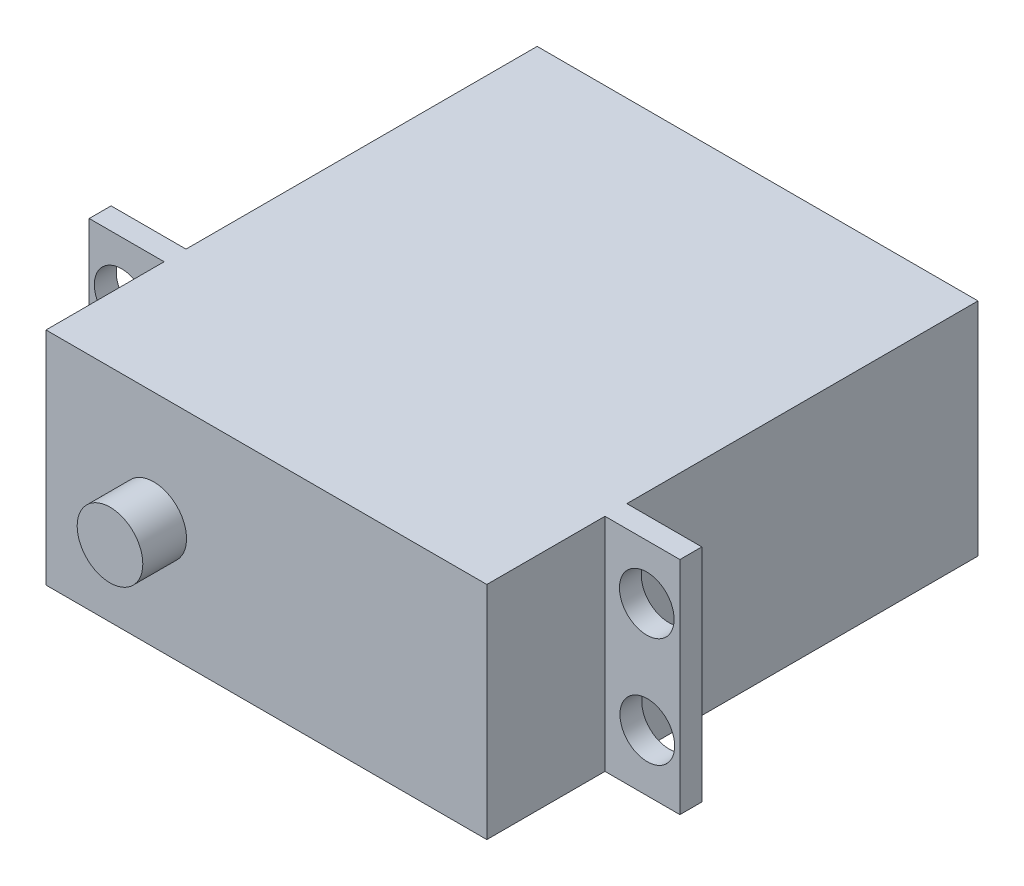
ISO-10303-21;
HEADER;
FILE_DESCRIPTION(('STEP AP214'),'2;1');
FILE_NAME('part.step','',(''),(''),'','','');
FILE_SCHEMA(('AUTOMOTIVE_DESIGN { 1 0 10303 214 1 1 1 1 }'));
ENDSEC;
DATA;
#1=APPLICATION_CONTEXT('core data for automotive mechanical design processes');
#2=APPLICATION_PROTOCOL_DEFINITION('international standard','automotive_design',2000,#1);
#3=PRODUCT_CONTEXT('',#1,'mechanical');
#4=PRODUCT('Part','Part','',(#3));
#5=PRODUCT_RELATED_PRODUCT_CATEGORY('part','',(#4));
#6=PRODUCT_DEFINITION_FORMATION('','',#4);
#7=PRODUCT_DEFINITION_CONTEXT('part definition',#1,'design');
#8=PRODUCT_DEFINITION('design','',#6,#7);
#9=PRODUCT_DEFINITION_SHAPE('','',#8);
#10=(LENGTH_UNIT() NAMED_UNIT(*) SI_UNIT(.MILLI.,.METRE.));
#11=(NAMED_UNIT(*) PLANE_ANGLE_UNIT() SI_UNIT($,.RADIAN.));
#12=(NAMED_UNIT(*) SI_UNIT($,.STERADIAN.) SOLID_ANGLE_UNIT());
#13=UNCERTAINTY_MEASURE_WITH_UNIT(LENGTH_MEASURE(1.E-05),#10,'distance_accuracy_value','');
#14=(GEOMETRIC_REPRESENTATION_CONTEXT(3) GLOBAL_UNCERTAINTY_ASSIGNED_CONTEXT((#13)) GLOBAL_UNIT_ASSIGNED_CONTEXT((#10,
#11,#12)) REPRESENTATION_CONTEXT('',''));
#15=CARTESIAN_POINT('',(0.,0.,0.));
#16=DIRECTION('',(0.,0.,1.));
#17=DIRECTION('',(1.,0.,0.));
#18=AXIS2_PLACEMENT_3D('',#15,#16,#17);
#19=CARTESIAN_POINT('',(0.,0.,34.1));
#20=DIRECTION('',(0.,0.,1.));
#21=DIRECTION('',(1.,0.,0.));
#22=AXIS2_PLACEMENT_3D('',#19,#20,#21);
#23=PLANE('',#22);
#24=CARTESIAN_POINT('',(-3.83205536866129,0.591291405632442,34.1));
#25=DIRECTION('',(0.,0.,1.));
#26=DIRECTION('',(1.,0.,0.));
#27=AXIS2_PLACEMENT_3D('',#24,#25,#26);
#28=CIRCLE('',#27,2.5);
#29=CARTESIAN_POINT('',(-1.33205536866129,0.591291405632442,34.1));
#30=VERTEX_POINT('',#29);
#31=EDGE_CURVE('E192',#30,#30,#28,.T.);
#32=ORIENTED_EDGE('',*,*,#31,.F.);
#33=EDGE_LOOP('',(#32));
#34=FACE_BOUND('',#33,.T.);
#35=CARTESIAN_POINT('',(-3.87999999999999,10.5911764705882,34.1));
#36=DIRECTION('',(0.,0.,1.));
#37=DIRECTION('',(1.,0.,0.));
#38=AXIS2_PLACEMENT_3D('',#35,#36,#37);
#39=CIRCLE('',#38,2.5);
#40=CARTESIAN_POINT('',(-1.37999999999999,10.5911764705882,34.1));
#41=VERTEX_POINT('',#40);
#42=EDGE_CURVE('E189',#41,#41,#39,.T.);
#43=ORIENTED_EDGE('',*,*,#42,.F.);
#44=EDGE_LOOP('',(#43));
#45=FACE_BOUND('',#44,.T.);
#46=DIRECTION('',(0.,-1.,0.));
#47=VECTOR('',#46,1.);
#48=CARTESIAN_POINT('',(0.,-4.60882352941177,34.1));
#49=LINE('',#48,#47);
#50=CARTESIAN_POINT('',(0.,15.5911764705882,34.1));
#51=VERTEX_POINT('',#50);
#52=CARTESIAN_POINT('',(0.,-4.60882352941177,34.1));
#53=VERTEX_POINT('',#52);
#54=EDGE_CURVE('E53',#51,#53,#49,.T.);
#55=ORIENTED_EDGE('',*,*,#54,.F.);
#56=DIRECTION('',(-1.,0.,0.));
#57=VECTOR('',#56,1.);
#58=CARTESIAN_POINT('',(-6.85,15.5911764705882,34.1));
#59=LINE('',#58,#57);
#60=CARTESIAN_POINT('',(-6.85,15.5911764705882,34.1));
#61=VERTEX_POINT('',#60);
#62=EDGE_CURVE('E176',#51,#61,#59,.T.);
#63=ORIENTED_EDGE('',*,*,#62,.T.);
#64=DIRECTION('',(0.,-1.,0.));
#65=VECTOR('',#64,1.);
#66=CARTESIAN_POINT('',(-6.85,15.5911764705882,34.1));
#67=LINE('',#66,#65);
#68=CARTESIAN_POINT('',(-6.85,-4.60882352941177,34.1));
#69=VERTEX_POINT('',#68);
#70=EDGE_CURVE('E171',#61,#69,#67,.T.);
#71=ORIENTED_EDGE('',*,*,#70,.T.);
#72=DIRECTION('',(1.,0.,0.));
#73=VECTOR('',#72,1.);
#74=CARTESIAN_POINT('',(-6.85,-4.60882352941177,34.1));
#75=LINE('',#74,#73);
#76=EDGE_CURVE('E285',#69,#53,#75,.T.);
#77=ORIENTED_EDGE('',*,*,#76,.T.);
#78=EDGE_LOOP('',(#55,#63,#71,#77));
#79=FACE_BOUND('',#78,.T.);
#80=ADVANCED_FACE('F36',(#34,#45,#79),#23,.T.);
#81=CARTESIAN_POINT('',(0.,15.5911764705882,32.1));
#82=DIRECTION('',(1.,0.,0.));
#83=DIRECTION('',(0.,1.,0.));
#84=AXIS2_PLACEMENT_3D('',#81,#82,#83);
#85=PLANE('',#84);
#86=DIRECTION('',(0.,-1.,0.));
#87=VECTOR('',#86,1.);
#88=CARTESIAN_POINT('',(0.,15.5911764705882,0.));
#89=LINE('',#88,#87);
#90=CARTESIAN_POINT('',(0.,15.5911764705882,0.));
#91=VERTEX_POINT('',#90);
#92=CARTESIAN_POINT('',(0.,-4.60882352941177,0.));
#93=VERTEX_POINT('',#92);
#94=EDGE_CURVE('E267',#91,#93,#89,.T.);
#95=ORIENTED_EDGE('',*,*,#94,.T.);
#96=DIRECTION('',(0.,0.,-1.));
#97=VECTOR('',#96,1.);
#98=CARTESIAN_POINT('',(0.,-4.60882352941177,32.1));
#99=LINE('',#98,#97);
#100=CARTESIAN_POINT('',(0.,-4.60882352941177,32.1));
#101=VERTEX_POINT('',#100);
#102=EDGE_CURVE('E45',#101,#93,#99,.T.);
#103=ORIENTED_EDGE('',*,*,#102,.F.);
#104=DIRECTION('',(0.,-1.,0.));
#105=VECTOR('',#104,1.);
#106=CARTESIAN_POINT('',(0.,15.5911764705882,32.1));
#107=LINE('',#106,#105);
#108=CARTESIAN_POINT('',(0.,15.5911764705882,32.1));
#109=VERTEX_POINT('',#108);
#110=EDGE_CURVE('E300',#109,#101,#107,.T.);
#111=ORIENTED_EDGE('',*,*,#110,.F.);
#112=DIRECTION('',(0.,0.,-1.));
#113=VECTOR('',#112,1.);
#114=CARTESIAN_POINT('',(0.,15.5911764705882,32.1));
#115=LINE('',#114,#113);
#116=EDGE_CURVE('E291',#109,#91,#115,.T.);
#117=ORIENTED_EDGE('',*,*,#116,.T.);
#118=EDGE_LOOP('',(#95,#103,#111,#117));
#119=FACE_BOUND('',#118,.T.);
#120=ADVANCED_FACE('F38',(#119),#85,.F.);
#121=CARTESIAN_POINT('',(0.,-4.60882352941177,32.1));
#122=DIRECTION('',(0.,1.,0.));
#123=DIRECTION('',(0.,0.,1.));
#124=AXIS2_PLACEMENT_3D('',#121,#122,#123);
#125=PLANE('',#124);
#126=DIRECTION('',(1.,0.,0.));
#127=VECTOR('',#126,1.);
#128=CARTESIAN_POINT('',(0.,-4.60882352941177,0.));
#129=LINE('',#128,#127);
#130=CARTESIAN_POINT('',(40.3,-4.60882352941177,0.));
#131=VERTEX_POINT('',#130);
#132=EDGE_CURVE('E315',#93,#131,#129,.T.);
#133=ORIENTED_EDGE('',*,*,#132,.T.);
#134=DIRECTION('',(0.,0.,-1.));
#135=VECTOR('',#134,1.);
#136=CARTESIAN_POINT('',(40.3,-4.60882352941177,32.1));
#137=LINE('',#136,#135);
#138=CARTESIAN_POINT('',(40.3,-4.60882352941177,32.1));
#139=VERTEX_POINT('',#138);
#140=EDGE_CURVE('E299',#139,#131,#137,.T.);
#141=ORIENTED_EDGE('',*,*,#140,.F.);
#142=DIRECTION('',(1.,0.,0.));
#143=VECTOR('',#142,1.);
#144=CARTESIAN_POINT('',(-6.85,-4.60882352941177,32.1));
#145=LINE('',#144,#143);
#146=CARTESIAN_POINT('',(47.15,-4.60882352941177,32.1));
#147=VERTEX_POINT('',#146);
#148=EDGE_CURVE('E151',#139,#147,#145,.T.);
#149=ORIENTED_EDGE('',*,*,#148,.T.);
#150=DIRECTION('',(0.,0.,-1.));
#151=VECTOR('',#150,1.);
#152=CARTESIAN_POINT('',(47.15,-4.60882352941177,34.1));
#153=LINE('',#152,#151);
#154=CARTESIAN_POINT('',(47.15,-4.60882352941177,34.1));
#155=VERTEX_POINT('',#154);
#156=EDGE_CURVE('E268',#155,#147,#153,.T.);
#157=ORIENTED_EDGE('',*,*,#156,.F.);
#158=CARTESIAN_POINT('',(40.3,-4.60882352941177,34.1));
#159=VERTEX_POINT('',#158);
#160=EDGE_CURVE('E280',#159,#155,#75,.T.);
#161=ORIENTED_EDGE('',*,*,#160,.F.);
#162=DIRECTION('',(0.,0.,-1.));
#163=VECTOR('',#162,1.);
#164=CARTESIAN_POINT('',(40.3,-4.60882352941177,44.9));
#165=LINE('',#164,#163);
#166=CARTESIAN_POINT('',(40.3,-4.60882352941177,44.9));
#167=VERTEX_POINT('',#166);
#168=EDGE_CURVE('E133',#167,#159,#165,.T.);
#169=ORIENTED_EDGE('',*,*,#168,.F.);
#170=DIRECTION('',(1.,0.,0.));
#171=VECTOR('',#170,1.);
#172=CARTESIAN_POINT('',(0.,-4.60882352941177,44.9));
#173=LINE('',#172,#171);
#174=CARTESIAN_POINT('',(0.,-4.60882352941177,44.9));
#175=VERTEX_POINT('',#174);
#176=EDGE_CURVE('E127',#175,#167,#173,.T.);
#177=ORIENTED_EDGE('',*,*,#176,.F.);
#178=DIRECTION('',(0.,0.,-1.));
#179=VECTOR('',#178,1.);
#180=CARTESIAN_POINT('',(0.,-4.60882352941177,44.9));
#181=LINE('',#180,#179);
#182=EDGE_CURVE('E131',#175,#53,#181,.T.);
#183=ORIENTED_EDGE('',*,*,#182,.T.);
#184=ORIENTED_EDGE('',*,*,#76,.F.);
#185=DIRECTION('',(0.,0.,-1.));
#186=VECTOR('',#185,1.);
#187=CARTESIAN_POINT('',(-6.85,-4.60882352941177,34.1));
#188=LINE('',#187,#186);
#189=CARTESIAN_POINT('',(-6.85,-4.60882352941177,32.1));
#190=VERTEX_POINT('',#189);
#191=EDGE_CURVE('E264',#69,#190,#188,.T.);
#192=ORIENTED_EDGE('',*,*,#191,.T.);
#193=EDGE_CURVE('E242',#190,#101,#145,.T.);
#194=ORIENTED_EDGE('',*,*,#193,.T.);
#195=ORIENTED_EDGE('',*,*,#102,.T.);
#196=EDGE_LOOP('',(#133,#141,#149,#157,#161,#169,#177,#183,#184,#192,#194,#195));
#197=FACE_BOUND('',#196,.T.);
#198=ADVANCED_FACE('F129',(#197),#125,.F.);
#199=CARTESIAN_POINT('',(40.3,15.5911764705882,32.1));
#200=DIRECTION('',(-1.,0.,0.));
#201=DIRECTION('',(0.,-1.,0.));
#202=AXIS2_PLACEMENT_3D('',#199,#200,#201);
#203=PLANE('',#202);
#204=DIRECTION('',(0.,1.,0.));
#205=VECTOR('',#204,1.);
#206=CARTESIAN_POINT('',(40.3,15.5911764705882,0.));
#207=LINE('',#206,#205);
#208=CARTESIAN_POINT('',(40.3,15.5911764705882,0.));
#209=VERTEX_POINT('',#208);
#210=EDGE_CURVE('E317',#131,#209,#207,.T.);
#211=ORIENTED_EDGE('',*,*,#210,.T.);
#212=DIRECTION('',(0.,0.,-1.));
#213=VECTOR('',#212,1.);
#214=CARTESIAN_POINT('',(40.3,15.5911764705882,32.1));
#215=LINE('',#214,#213);
#216=CARTESIAN_POINT('',(40.3,15.5911764705882,32.1));
#217=VERTEX_POINT('',#216);
#218=EDGE_CURVE('E294',#217,#209,#215,.T.);
#219=ORIENTED_EDGE('',*,*,#218,.F.);
#220=DIRECTION('',(0.,1.,0.));
#221=VECTOR('',#220,1.);
#222=CARTESIAN_POINT('',(40.3,15.5911764705882,32.1));
#223=LINE('',#222,#221);
#224=EDGE_CURVE('E237',#139,#217,#223,.T.);
#225=ORIENTED_EDGE('',*,*,#224,.F.);
#226=ORIENTED_EDGE('',*,*,#140,.T.);
#227=EDGE_LOOP('',(#211,#219,#225,#226));
#228=FACE_BOUND('',#227,.T.);
#229=ADVANCED_FACE('F458',(#228),#203,.F.);
#230=CARTESIAN_POINT('',(0.,15.5911764705882,32.1));
#231=DIRECTION('',(0.,-1.,0.));
#232=DIRECTION('',(0.,0.,-1.));
#233=AXIS2_PLACEMENT_3D('',#230,#231,#232);
#234=PLANE('',#233);
#235=DIRECTION('',(-1.,0.,0.));
#236=VECTOR('',#235,1.);
#237=CARTESIAN_POINT('',(0.,15.5911764705882,0.));
#238=LINE('',#237,#236);
#239=EDGE_CURVE('E303',#209,#91,#238,.T.);
#240=ORIENTED_EDGE('',*,*,#239,.T.);
#241=ORIENTED_EDGE('',*,*,#116,.F.);
#242=DIRECTION('',(-1.,0.,0.));
#243=VECTOR('',#242,1.);
#244=CARTESIAN_POINT('',(-6.85,15.5911764705882,32.1));
#245=LINE('',#244,#243);
#246=CARTESIAN_POINT('',(-6.85,15.5911764705882,32.1));
#247=VERTEX_POINT('',#246);
#248=EDGE_CURVE('E255',#109,#247,#245,.T.);
#249=ORIENTED_EDGE('',*,*,#248,.T.);
#250=DIRECTION('',(0.,0.,-1.));
#251=VECTOR('',#250,1.);
#252=CARTESIAN_POINT('',(-6.85,15.5911764705882,34.1));
#253=LINE('',#252,#251);
#254=EDGE_CURVE('E258',#61,#247,#253,.T.);
#255=ORIENTED_EDGE('',*,*,#254,.F.);
#256=ORIENTED_EDGE('',*,*,#62,.F.);
#257=DIRECTION('',(0.,0.,-1.));
#258=VECTOR('',#257,1.);
#259=CARTESIAN_POINT('',(0.,15.5911764705882,44.9));
#260=LINE('',#259,#258);
#261=CARTESIAN_POINT('',(0.,15.5911764705882,44.9));
#262=VERTEX_POINT('',#261);
#263=EDGE_CURVE('E163',#262,#51,#260,.T.);
#264=ORIENTED_EDGE('',*,*,#263,.F.);
#265=DIRECTION('',(-1.,0.,0.));
#266=VECTOR('',#265,1.);
#267=CARTESIAN_POINT('',(0.,15.5911764705882,44.9));
#268=LINE('',#267,#266);
#269=CARTESIAN_POINT('',(40.3,15.5911764705882,44.9));
#270=VERTEX_POINT('',#269);
#271=EDGE_CURVE('E142',#270,#262,#268,.T.);
#272=ORIENTED_EDGE('',*,*,#271,.F.);
#273=DIRECTION('',(0.,0.,-1.));
#274=VECTOR('',#273,1.);
#275=CARTESIAN_POINT('',(40.3,15.5911764705882,44.9));
#276=LINE('',#275,#274);
#277=CARTESIAN_POINT('',(40.3,15.5911764705882,34.1));
#278=VERTEX_POINT('',#277);
#279=EDGE_CURVE('E153',#270,#278,#276,.T.);
#280=ORIENTED_EDGE('',*,*,#279,.T.);
#281=CARTESIAN_POINT('',(47.15,15.5911764705882,34.1));
#282=VERTEX_POINT('',#281);
#283=EDGE_CURVE('E273',#282,#278,#59,.T.);
#284=ORIENTED_EDGE('',*,*,#283,.F.);
#285=DIRECTION('',(0.,0.,-1.));
#286=VECTOR('',#285,1.);
#287=CARTESIAN_POINT('',(47.15,15.5911764705882,34.1));
#288=LINE('',#287,#286);
#289=CARTESIAN_POINT('',(47.15,15.5911764705882,32.1));
#290=VERTEX_POINT('',#289);
#291=EDGE_CURVE('E269',#282,#290,#288,.T.);
#292=ORIENTED_EDGE('',*,*,#291,.T.);
#293=EDGE_CURVE('E262',#290,#217,#245,.T.);
#294=ORIENTED_EDGE('',*,*,#293,.T.);
#295=ORIENTED_EDGE('',*,*,#218,.T.);
#296=EDGE_LOOP('',(#240,#241,#249,#255,#256,#264,#272,#280,#284,#292,#294,#295));
#297=FACE_BOUND('',#296,.T.);
#298=ADVANCED_FACE('F321',(#297),#234,.F.);
#299=CARTESIAN_POINT('',(0.,0.,0.));
#300=DIRECTION('',(0.,0.,1.));
#301=DIRECTION('',(1.,0.,0.));
#302=AXIS2_PLACEMENT_3D('',#299,#300,#301);
#303=PLANE('',#302);
#304=ORIENTED_EDGE('',*,*,#94,.F.);
#305=ORIENTED_EDGE('',*,*,#239,.F.);
#306=ORIENTED_EDGE('',*,*,#210,.F.);
#307=ORIENTED_EDGE('',*,*,#132,.F.);
#308=EDGE_LOOP('',(#304,#305,#306,#307));
#309=FACE_BOUND('',#308,.T.);
#310=ADVANCED_FACE('F326',(#309),#303,.F.);
#311=CARTESIAN_POINT('',(0.,0.,32.1));
#312=DIRECTION('',(0.,0.,1.));
#313=DIRECTION('',(1.,0.,0.));
#314=AXIS2_PLACEMENT_3D('',#311,#312,#313);
#315=PLANE('',#314);
#316=CARTESIAN_POINT('',(-3.83205536866129,0.591291405632442,32.1));
#317=DIRECTION('',(0.,0.,1.));
#318=DIRECTION('',(1.,0.,0.));
#319=AXIS2_PLACEMENT_3D('',#316,#317,#318);
#320=CIRCLE('',#319,2.5);
#321=CARTESIAN_POINT('',(-1.33205536866129,0.591291405632442,32.1));
#322=VERTEX_POINT('',#321);
#323=EDGE_CURVE('E40',#322,#322,#320,.T.);
#324=ORIENTED_EDGE('',*,*,#323,.T.);
#325=EDGE_LOOP('',(#324));
#326=FACE_BOUND('',#325,.T.);
#327=CARTESIAN_POINT('',(-3.87999999999999,10.5911764705882,32.1));
#328=DIRECTION('',(0.,0.,1.));
#329=DIRECTION('',(1.,0.,0.));
#330=AXIS2_PLACEMENT_3D('',#327,#328,#329);
#331=CIRCLE('',#330,2.5);
#332=CARTESIAN_POINT('',(-1.37999999999999,10.5911764705882,32.1));
#333=VERTEX_POINT('',#332);
#334=EDGE_CURVE('E188',#333,#333,#331,.T.);
#335=ORIENTED_EDGE('',*,*,#334,.T.);
#336=EDGE_LOOP('',(#335));
#337=FACE_BOUND('',#336,.T.);
#338=ORIENTED_EDGE('',*,*,#248,.F.);
#339=ORIENTED_EDGE('',*,*,#110,.T.);
#340=ORIENTED_EDGE('',*,*,#193,.F.);
#341=DIRECTION('',(0.,-1.,0.));
#342=VECTOR('',#341,1.);
#343=CARTESIAN_POINT('',(-6.85,15.5911764705882,32.1));
#344=LINE('',#343,#342);
#345=EDGE_CURVE('E148',#247,#190,#344,.T.);
#346=ORIENTED_EDGE('',*,*,#345,.F.);
#347=EDGE_LOOP('',(#338,#339,#340,#346));
#348=FACE_BOUND('',#347,.T.);
#349=ADVANCED_FACE('F229',(#326,#337,#348),#315,.F.);
#350=CARTESIAN_POINT('',(44.1679446313387,0.591291405632438,32.1));
#351=DIRECTION('',(0.,0.,1.));
#352=DIRECTION('',(1.,0.,0.));
#353=AXIS2_PLACEMENT_3D('',#350,#351,#352);
#354=CIRCLE('',#353,2.5);
#355=CARTESIAN_POINT('',(46.6679446313387,0.591291405632438,32.1));
#356=VERTEX_POINT('',#355);
#357=EDGE_CURVE('E201',#356,#356,#354,.T.);
#358=ORIENTED_EDGE('',*,*,#357,.T.);
#359=EDGE_LOOP('',(#358));
#360=FACE_BOUND('',#359,.T.);
#361=CARTESIAN_POINT('',(44.12,10.5911764705882,32.1));
#362=DIRECTION('',(0.,0.,1.));
#363=DIRECTION('',(1.,0.,0.));
#364=AXIS2_PLACEMENT_3D('',#361,#362,#363);
#365=CIRCLE('',#364,2.5);
#366=CARTESIAN_POINT('',(46.62,10.5911764705882,32.1));
#367=VERTEX_POINT('',#366);
#368=EDGE_CURVE('E195',#367,#367,#365,.T.);
#369=ORIENTED_EDGE('',*,*,#368,.T.);
#370=EDGE_LOOP('',(#369));
#371=FACE_BOUND('',#370,.T.);
#372=ORIENTED_EDGE('',*,*,#148,.F.);
#373=ORIENTED_EDGE('',*,*,#224,.T.);
#374=ORIENTED_EDGE('',*,*,#293,.F.);
#375=DIRECTION('',(0.,1.,0.));
#376=VECTOR('',#375,1.);
#377=CARTESIAN_POINT('',(47.15,15.5911764705882,32.1));
#378=LINE('',#377,#376);
#379=EDGE_CURVE('E239',#147,#290,#378,.T.);
#380=ORIENTED_EDGE('',*,*,#379,.F.);
#381=EDGE_LOOP('',(#372,#373,#374,#380));
#382=FACE_BOUND('',#381,.T.);
#383=ADVANCED_FACE('F225',(#360,#371,#382),#315,.F.);
#384=CARTESIAN_POINT('',(-6.85,15.5911764705882,34.1));
#385=DIRECTION('',(1.,0.,0.));
#386=DIRECTION('',(0.,1.,0.));
#387=AXIS2_PLACEMENT_3D('',#384,#385,#386);
#388=PLANE('',#387);
#389=ORIENTED_EDGE('',*,*,#345,.T.);
#390=ORIENTED_EDGE('',*,*,#191,.F.);
#391=ORIENTED_EDGE('',*,*,#70,.F.);
#392=ORIENTED_EDGE('',*,*,#254,.T.);
#393=EDGE_LOOP('',(#389,#390,#391,#392));
#394=FACE_BOUND('',#393,.T.);
#395=ADVANCED_FACE('F228',(#394),#388,.F.);
#396=CARTESIAN_POINT('',(47.15,15.5911764705882,34.1));
#397=DIRECTION('',(-1.,0.,0.));
#398=DIRECTION('',(0.,0.,1.));
#399=AXIS2_PLACEMENT_3D('',#396,#397,#398);
#400=PLANE('',#399);
#401=ORIENTED_EDGE('',*,*,#379,.T.);
#402=ORIENTED_EDGE('',*,*,#291,.F.);
#403=DIRECTION('',(0.,1.,0.));
#404=VECTOR('',#403,1.);
#405=CARTESIAN_POINT('',(47.15,15.5911764705882,34.1));
#406=LINE('',#405,#404);
#407=EDGE_CURVE('E278',#155,#282,#406,.T.);
#408=ORIENTED_EDGE('',*,*,#407,.F.);
#409=ORIENTED_EDGE('',*,*,#156,.T.);
#410=EDGE_LOOP('',(#401,#402,#408,#409));
#411=FACE_BOUND('',#410,.T.);
#412=ADVANCED_FACE('F214',(#411),#400,.F.);
#413=CARTESIAN_POINT('',(44.1679446313387,0.591291405632438,34.1));
#414=DIRECTION('',(0.,0.,1.));
#415=DIRECTION('',(1.,0.,0.));
#416=AXIS2_PLACEMENT_3D('',#413,#414,#415);
#417=CIRCLE('',#416,2.5);
#418=CARTESIAN_POINT('',(46.6679446313387,0.591291405632438,34.1));
#419=VERTEX_POINT('',#418);
#420=EDGE_CURVE('E204',#419,#419,#417,.T.);
#421=ORIENTED_EDGE('',*,*,#420,.F.);
#422=EDGE_LOOP('',(#421));
#423=FACE_BOUND('',#422,.T.);
#424=CARTESIAN_POINT('',(44.12,10.5911764705882,34.1));
#425=DIRECTION('',(0.,0.,1.));
#426=DIRECTION('',(1.,0.,0.));
#427=AXIS2_PLACEMENT_3D('',#424,#425,#426);
#428=CIRCLE('',#427,2.5);
#429=CARTESIAN_POINT('',(46.62,10.5911764705882,34.1));
#430=VERTEX_POINT('',#429);
#431=EDGE_CURVE('E198',#430,#430,#428,.T.);
#432=ORIENTED_EDGE('',*,*,#431,.F.);
#433=EDGE_LOOP('',(#432));
#434=FACE_BOUND('',#433,.T.);
#435=DIRECTION('',(0.,1.,0.));
#436=VECTOR('',#435,1.);
#437=CARTESIAN_POINT('',(40.3,-4.60882352941177,34.1));
#438=LINE('',#437,#436);
#439=EDGE_CURVE('E61',#159,#278,#438,.T.);
#440=ORIENTED_EDGE('',*,*,#439,.F.);
#441=ORIENTED_EDGE('',*,*,#160,.T.);
#442=ORIENTED_EDGE('',*,*,#407,.T.);
#443=ORIENTED_EDGE('',*,*,#283,.T.);
#444=EDGE_LOOP('',(#440,#441,#442,#443));
#445=FACE_BOUND('',#444,.T.);
#446=ADVANCED_FACE('F211',(#423,#434,#445),#23,.T.);
#447=CARTESIAN_POINT('',(0.,-4.60882352941177,44.9));
#448=DIRECTION('',(1.,0.,0.));
#449=DIRECTION('',(0.,0.,-1.));
#450=AXIS2_PLACEMENT_3D('',#447,#448,#449);
#451=PLANE('',#450);
#452=ORIENTED_EDGE('',*,*,#54,.T.);
#453=ORIENTED_EDGE('',*,*,#182,.F.);
#454=DIRECTION('',(0.,-1.,0.));
#455=VECTOR('',#454,1.);
#456=CARTESIAN_POINT('',(0.,-4.60882352941177,44.9));
#457=LINE('',#456,#455);
#458=EDGE_CURVE('E137',#262,#175,#457,.T.);
#459=ORIENTED_EDGE('',*,*,#458,.F.);
#460=ORIENTED_EDGE('',*,*,#263,.T.);
#461=EDGE_LOOP('',(#452,#453,#459,#460));
#462=FACE_BOUND('',#461,.T.);
#463=ADVANCED_FACE('F147',(#462),#451,.F.);
#464=CARTESIAN_POINT('',(40.3,-4.60882352941177,44.9));
#465=DIRECTION('',(-1.,0.,0.));
#466=DIRECTION('',(0.,0.,1.));
#467=AXIS2_PLACEMENT_3D('',#464,#465,#466);
#468=PLANE('',#467);
#469=ORIENTED_EDGE('',*,*,#439,.T.);
#470=ORIENTED_EDGE('',*,*,#279,.F.);
#471=DIRECTION('',(0.,1.,0.));
#472=VECTOR('',#471,1.);
#473=CARTESIAN_POINT('',(40.3,-4.60882352941177,44.9));
#474=LINE('',#473,#472);
#475=EDGE_CURVE('E136',#167,#270,#474,.T.);
#476=ORIENTED_EDGE('',*,*,#475,.F.);
#477=ORIENTED_EDGE('',*,*,#168,.T.);
#478=EDGE_LOOP('',(#469,#470,#476,#477));
#479=FACE_BOUND('',#478,.T.);
#480=ADVANCED_FACE('F382',(#479),#468,.F.);
#481=CARTESIAN_POINT('',(0.,0.,44.9));
#482=DIRECTION('',(0.,0.,-1.));
#483=DIRECTION('',(-1.,0.,0.));
#484=AXIS2_PLACEMENT_3D('',#481,#482,#483);
#485=PLANE('',#484);
#486=CARTESIAN_POINT('',(9.85,5.49117647058823,44.9));
#487=DIRECTION('',(0.,0.,-1.));
#488=DIRECTION('',(-1.,0.,0.));
#489=AXIS2_PLACEMENT_3D('',#486,#487,#488);
#490=CIRCLE('',#489,3.);
#491=CARTESIAN_POINT('',(6.85,5.49117647058823,44.9));
#492=VERTEX_POINT('',#491);
#493=EDGE_CURVE('E11',#492,#492,#490,.F.);
#494=ORIENTED_EDGE('',*,*,#493,.F.);
#495=EDGE_LOOP('',(#494));
#496=FACE_BOUND('',#495,.T.);
#497=ORIENTED_EDGE('',*,*,#458,.T.);
#498=ORIENTED_EDGE('',*,*,#176,.T.);
#499=ORIENTED_EDGE('',*,*,#475,.T.);
#500=ORIENTED_EDGE('',*,*,#271,.T.);
#501=EDGE_LOOP('',(#497,#498,#499,#500));
#502=FACE_BOUND('',#501,.T.);
#503=ADVANCED_FACE('F140',(#496,#502),#485,.F.);
#504=CARTESIAN_POINT('',(9.85,5.49117647058823,48.9));
#505=DIRECTION('',(0.,0.,-1.));
#506=DIRECTION('',(-1.,0.,0.));
#507=AXIS2_PLACEMENT_3D('',#504,#505,#506);
#508=CYLINDRICAL_SURFACE('',#507,3.);
#509=CARTESIAN_POINT('',(9.85,5.49117647058823,48.9));
#510=DIRECTION('',(0.,0.,1.));
#511=DIRECTION('',(1.,0.,0.));
#512=AXIS2_PLACEMENT_3D('',#509,#510,#511);
#513=CIRCLE('',#512,3.);
#514=CARTESIAN_POINT('',(12.85,5.49117647058823,48.9));
#515=VERTEX_POINT('',#514);
#516=EDGE_CURVE('E162',#515,#515,#513,.T.);
#517=ORIENTED_EDGE('',*,*,#516,.F.);
#518=EDGE_LOOP('',(#517));
#519=FACE_BOUND('',#518,.T.);
#520=ORIENTED_EDGE('',*,*,#493,.T.);
#521=EDGE_LOOP('',(#520));
#522=FACE_BOUND('',#521,.T.);
#523=ADVANCED_FACE('F374',(#519,#522),#508,.T.);
#524=CARTESIAN_POINT('',(9.85,5.49117647058823,48.9));
#525=DIRECTION('',(0.,0.,1.));
#526=DIRECTION('',(1.,0.,0.));
#527=AXIS2_PLACEMENT_3D('',#524,#525,#526);
#528=PLANE('',#527);
#529=ORIENTED_EDGE('',*,*,#516,.T.);
#530=EDGE_LOOP('',(#529));
#531=FACE_BOUND('',#530,.T.);
#532=ADVANCED_FACE('F365',(#531),#528,.T.);
#533=CARTESIAN_POINT('',(-3.87999999999999,10.5911764705882,30.1));
#534=DIRECTION('',(0.,0.,1.));
#535=DIRECTION('',(1.,0.,0.));
#536=AXIS2_PLACEMENT_3D('',#533,#534,#535);
#537=CYLINDRICAL_SURFACE('',#536,2.5);
#538=ORIENTED_EDGE('',*,*,#42,.T.);
#539=EDGE_LOOP('',(#538));
#540=FACE_BOUND('',#539,.T.);
#541=ORIENTED_EDGE('',*,*,#334,.F.);
#542=EDGE_LOOP('',(#541));
#543=FACE_BOUND('',#542,.T.);
#544=ADVANCED_FACE('F363',(#540,#543),#537,.F.);
#545=CARTESIAN_POINT('',(-3.83205536866129,0.591291405632442,30.1));
#546=DIRECTION('',(0.,0.,1.));
#547=DIRECTION('',(1.,0.,0.));
#548=AXIS2_PLACEMENT_3D('',#545,#546,#547);
#549=CYLINDRICAL_SURFACE('',#548,2.5);
#550=ORIENTED_EDGE('',*,*,#31,.T.);
#551=EDGE_LOOP('',(#550));
#552=FACE_BOUND('',#551,.T.);
#553=ORIENTED_EDGE('',*,*,#323,.F.);
#554=EDGE_LOOP('',(#553));
#555=FACE_BOUND('',#554,.T.);
#556=ADVANCED_FACE('F221',(#552,#555),#549,.F.);
#557=CARTESIAN_POINT('',(44.12,10.5911764705882,30.1));
#558=DIRECTION('',(0.,0.,1.));
#559=DIRECTION('',(1.,0.,0.));
#560=AXIS2_PLACEMENT_3D('',#557,#558,#559);
#561=CYLINDRICAL_SURFACE('',#560,2.5);
#562=ORIENTED_EDGE('',*,*,#431,.T.);
#563=EDGE_LOOP('',(#562));
#564=FACE_BOUND('',#563,.T.);
#565=ORIENTED_EDGE('',*,*,#368,.F.);
#566=EDGE_LOOP('',(#565));
#567=FACE_BOUND('',#566,.T.);
#568=ADVANCED_FACE('F218',(#564,#567),#561,.F.);
#569=CARTESIAN_POINT('',(44.1679446313387,0.591291405632438,30.1));
#570=DIRECTION('',(0.,0.,1.));
#571=DIRECTION('',(1.,0.,0.));
#572=AXIS2_PLACEMENT_3D('',#569,#570,#571);
#573=CYLINDRICAL_SURFACE('',#572,2.5);
#574=ORIENTED_EDGE('',*,*,#420,.T.);
#575=EDGE_LOOP('',(#574));
#576=FACE_BOUND('',#575,.T.);
#577=ORIENTED_EDGE('',*,*,#357,.F.);
#578=EDGE_LOOP('',(#577));
#579=FACE_BOUND('',#578,.T.);
#580=ADVANCED_FACE('F208',(#576,#579),#573,.F.);
#581=CLOSED_SHELL('',(#80,#120,#198,#229,#298,#310,#349,#383,#395,#412,#446,#463,#480,#503,#523,
#532,#544,#556,#568,#580));
#582=MANIFOLD_SOLID_BREP('B2',#581);
#583=ADVANCED_BREP_SHAPE_REPRESENTATION('',(#18,#582),#14);
#584=SHAPE_DEFINITION_REPRESENTATION(#9,#583);
ENDSEC;
END-ISO-10303-21;
